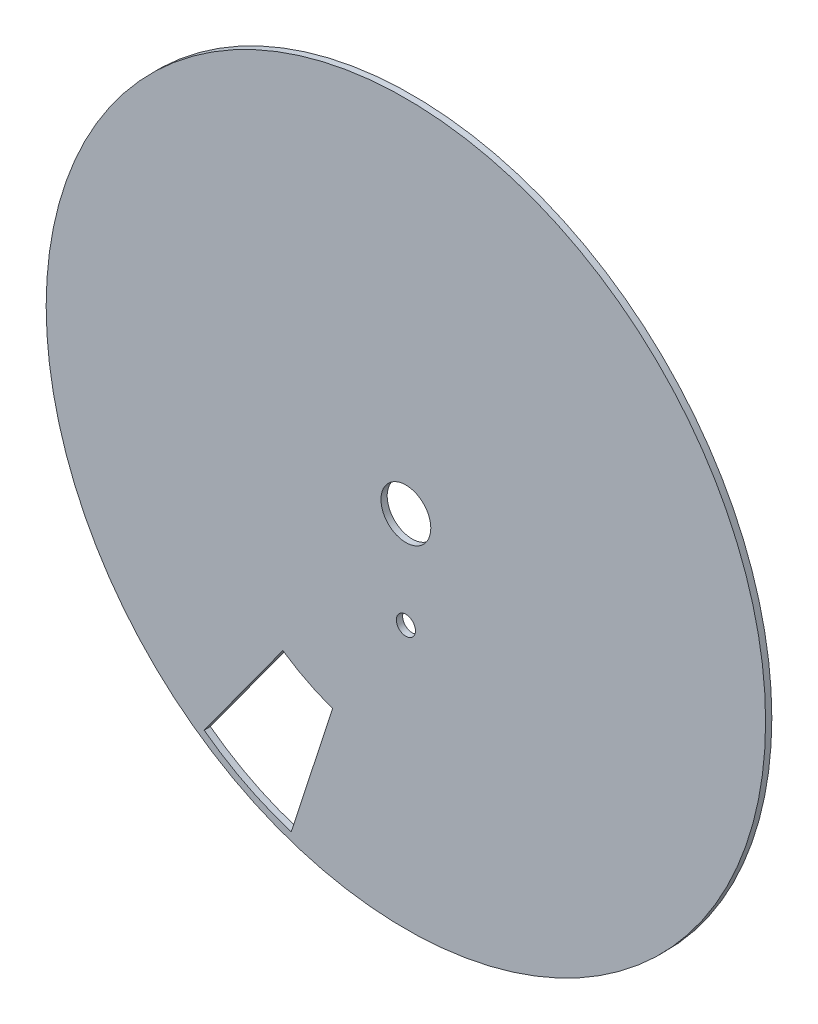
ISO-10303-21;
HEADER;
FILE_DESCRIPTION(('STEP AP214'),'2;1');
FILE_NAME('part.step','',(''),(''),'','','');
FILE_SCHEMA(('AUTOMOTIVE_DESIGN { 1 0 10303 214 1 1 1 1 }'));
ENDSEC;
DATA;
#1=APPLICATION_CONTEXT('core data for automotive mechanical design processes');
#2=APPLICATION_PROTOCOL_DEFINITION('international standard','automotive_design',2000,#1);
#3=PRODUCT_CONTEXT('',#1,'mechanical');
#4=PRODUCT('Part','Part','',(#3));
#5=PRODUCT_RELATED_PRODUCT_CATEGORY('part','',(#4));
#6=PRODUCT_DEFINITION_FORMATION('','',#4);
#7=PRODUCT_DEFINITION_CONTEXT('part definition',#1,'design');
#8=PRODUCT_DEFINITION('design','',#6,#7);
#9=PRODUCT_DEFINITION_SHAPE('','',#8);
#10=(LENGTH_UNIT() NAMED_UNIT(*) SI_UNIT(.MILLI.,.METRE.));
#11=(NAMED_UNIT(*) PLANE_ANGLE_UNIT() SI_UNIT($,.RADIAN.));
#12=(NAMED_UNIT(*) SI_UNIT($,.STERADIAN.) SOLID_ANGLE_UNIT());
#13=UNCERTAINTY_MEASURE_WITH_UNIT(LENGTH_MEASURE(1.E-05),#10,'distance_accuracy_value','');
#14=(GEOMETRIC_REPRESENTATION_CONTEXT(3) GLOBAL_UNCERTAINTY_ASSIGNED_CONTEXT((#13)) GLOBAL_UNIT_ASSIGNED_CONTEXT((#10,
#11,#12)) REPRESENTATION_CONTEXT('',''));
#15=CARTESIAN_POINT('',(0.,0.,0.));
#16=DIRECTION('',(0.,0.,1.));
#17=DIRECTION('',(1.,0.,0.));
#18=AXIS2_PLACEMENT_3D('',#15,#16,#17);
#19=CARTESIAN_POINT('',(0.,0.,1.));
#20=DIRECTION('',(0.,0.,1.));
#21=DIRECTION('',(1.,0.,0.));
#22=AXIS2_PLACEMENT_3D('',#19,#20,#21);
#23=PLANE('',#22);
#24=CARTESIAN_POINT('',(1.1518563880486E-12,2.30718222304915E-12,1.));
#25=DIRECTION('',(0.,0.,1.));
#26=DIRECTION('',(-1.,0.,0.));
#27=AXIS2_PLACEMENT_3D('',#24,#25,#26);
#28=CIRCLE('',#27,35.0000000000026);
#29=CARTESIAN_POINT('',(-19.7550681893245,-28.8918203101699,1.));
#30=VERTEX_POINT('',#29);
#31=CARTESIAN_POINT('',(-11.7622358896326,-32.9643717804032,1.));
#32=VERTEX_POINT('',#31);
#33=EDGE_CURVE('E78',#30,#32,#28,.T.);
#34=ORIENTED_EDGE('',*,*,#33,.T.);
#35=DIRECTION('',(-0.309016994374947,-0.951056516295154,0.));
#36=VECTOR('',#35,1.);
#37=CARTESIAN_POINT('',(-11.7622358896326,-32.9643717804032,1.));
#38=LINE('',#37,#36);
#39=CARTESIAN_POINT('',(-18.4051799941896,-53.4092514893739,1.));
#40=VERTEX_POINT('',#39);
#41=EDGE_CURVE('E87',#32,#40,#38,.T.);
#42=ORIENTED_EDGE('',*,*,#41,.T.);
#43=CARTESIAN_POINT('',(-4.7115915098692,-9.25861487224373,1.));
#44=DIRECTION('',(0.,0.,-1.));
#45=DIRECTION('',(-1.,0.,0.));
#46=AXIS2_PLACEMENT_3D('',#43,#44,#45);
#47=CIRCLE('',#46,46.2254592110862);
#48=CARTESIAN_POINT('',(-32.3896479515654,-46.2818274676692,1.));
#49=VERTEX_POINT('',#48);
#50=EDGE_CURVE('E50',#40,#49,#47,.T.);
#51=ORIENTED_EDGE('',*,*,#50,.T.);
#52=DIRECTION('',(0.587785252292473,0.809016994374948,0.));
#53=VECTOR('',#52,1.);
#54=CARTESIAN_POINT('',(-19.7550681893245,-28.8918203101699,1.));
#55=LINE('',#54,#53);
#56=EDGE_CURVE('E84',#49,#30,#55,.T.);
#57=ORIENTED_EDGE('',*,*,#56,.T.);
#58=EDGE_LOOP('',(#34,#42,#51,#57));
#59=FACE_BOUND('',#58,.T.);
#60=CARTESIAN_POINT('',(-7.00080184795615E-12,-15.5040048462578,1.));
#61=DIRECTION('',(0.,0.,-1.));
#62=DIRECTION('',(-1.,0.,0.));
#63=AXIS2_PLACEMENT_3D('',#60,#61,#62);
#64=CIRCLE('',#63,1.53);
#65=CARTESIAN_POINT('',(-1.530000000007,-15.5040048462578,1.));
#66=VERTEX_POINT('',#65);
#67=EDGE_CURVE('E108',#66,#66,#64,.T.);
#68=ORIENTED_EDGE('',*,*,#67,.T.);
#69=EDGE_LOOP('',(#68));
#70=FACE_BOUND('',#69,.T.);
#71=CARTESIAN_POINT('',(0.,0.,1.));
#72=DIRECTION('',(0.,0.,1.));
#73=DIRECTION('',(1.,0.,0.));
#74=AXIS2_PLACEMENT_3D('',#71,#72,#73);
#75=CIRCLE('',#74,57.75);
#76=CARTESIAN_POINT('',(57.75,0.,1.));
#77=VERTEX_POINT('',#76);
#78=EDGE_CURVE('E11',#77,#77,#75,.T.);
#79=ORIENTED_EDGE('',*,*,#78,.T.);
#80=EDGE_LOOP('',(#79));
#81=FACE_BOUND('',#80,.T.);
#82=CARTESIAN_POINT('',(0.,0.,1.));
#83=DIRECTION('',(0.,0.,1.));
#84=DIRECTION('',(1.,0.,0.));
#85=AXIS2_PLACEMENT_3D('',#82,#83,#84);
#86=CIRCLE('',#85,4.);
#87=CARTESIAN_POINT('',(4.,0.,1.));
#88=VERTEX_POINT('',#87);
#89=EDGE_CURVE('E114',#88,#88,#86,.T.);
#90=ORIENTED_EDGE('',*,*,#89,.F.);
#91=EDGE_LOOP('',(#90));
#92=FACE_BOUND('',#91,.T.);
#93=ADVANCED_FACE('F33',(#59,#70,#81,#92),#23,.T.);
#94=CARTESIAN_POINT('',(0.,0.,0.));
#95=DIRECTION('',(0.,0.,1.));
#96=DIRECTION('',(1.,0.,0.));
#97=AXIS2_PLACEMENT_3D('',#94,#95,#96);
#98=PLANE('',#97);
#99=DIRECTION('',(-0.309016994374947,-0.951056516295154,0.));
#100=VECTOR('',#99,1.);
#101=CARTESIAN_POINT('',(-11.7622358896326,-32.9643717804032,0.));
#102=LINE('',#101,#100);
#103=CARTESIAN_POINT('',(-11.7622358896326,-32.9643717804032,0.));
#104=VERTEX_POINT('',#103);
#105=CARTESIAN_POINT('',(-18.4051799941896,-53.4092514893739,0.));
#106=VERTEX_POINT('',#105);
#107=EDGE_CURVE('E102',#104,#106,#102,.T.);
#108=ORIENTED_EDGE('',*,*,#107,.F.);
#109=CARTESIAN_POINT('',(1.1518563880486E-12,2.30718222304915E-12,0.));
#110=DIRECTION('',(0.,0.,1.));
#111=DIRECTION('',(-1.,0.,0.));
#112=AXIS2_PLACEMENT_3D('',#109,#110,#111);
#113=CIRCLE('',#112,35.0000000000026);
#114=CARTESIAN_POINT('',(-19.7550681893245,-28.8918203101699,0.));
#115=VERTEX_POINT('',#114);
#116=EDGE_CURVE('E58',#115,#104,#113,.T.);
#117=ORIENTED_EDGE('',*,*,#116,.F.);
#118=DIRECTION('',(0.587785252292473,0.809016994374948,0.));
#119=VECTOR('',#118,1.);
#120=CARTESIAN_POINT('',(-19.7550681893245,-28.8918203101699,0.));
#121=LINE('',#120,#119);
#122=CARTESIAN_POINT('',(-32.3896479515654,-46.2818274676692,0.));
#123=VERTEX_POINT('',#122);
#124=EDGE_CURVE('E93',#123,#115,#121,.T.);
#125=ORIENTED_EDGE('',*,*,#124,.F.);
#126=CARTESIAN_POINT('',(-4.7115915098692,-9.25861487224373,0.));
#127=DIRECTION('',(0.,0.,-1.));
#128=DIRECTION('',(-1.,0.,0.));
#129=AXIS2_PLACEMENT_3D('',#126,#127,#128);
#130=CIRCLE('',#129,46.2254592110862);
#131=EDGE_CURVE('E96',#106,#123,#130,.T.);
#132=ORIENTED_EDGE('',*,*,#131,.F.);
#133=EDGE_LOOP('',(#108,#117,#125,#132));
#134=FACE_BOUND('',#133,.T.);
#135=CARTESIAN_POINT('',(-7.00080184795615E-12,-15.5040048462578,0.));
#136=DIRECTION('',(0.,0.,1.));
#137=DIRECTION('',(1.,0.,0.));
#138=AXIS2_PLACEMENT_3D('',#135,#136,#137);
#139=CIRCLE('',#138,1.53);
#140=CARTESIAN_POINT('',(1.529999999993,-15.5040048462578,0.));
#141=VERTEX_POINT('',#140);
#142=EDGE_CURVE('E37',#141,#141,#139,.T.);
#143=ORIENTED_EDGE('',*,*,#142,.T.);
#144=EDGE_LOOP('',(#143));
#145=FACE_BOUND('',#144,.T.);
#146=CARTESIAN_POINT('',(0.,0.,0.));
#147=DIRECTION('',(0.,0.,1.));
#148=DIRECTION('',(1.,0.,0.));
#149=AXIS2_PLACEMENT_3D('',#146,#147,#148);
#150=CIRCLE('',#149,57.75);
#151=CARTESIAN_POINT('',(57.75,0.,0.));
#152=VERTEX_POINT('',#151);
#153=EDGE_CURVE('E42',#152,#152,#150,.T.);
#154=ORIENTED_EDGE('',*,*,#153,.F.);
#155=EDGE_LOOP('',(#154));
#156=FACE_BOUND('',#155,.T.);
#157=CARTESIAN_POINT('',(0.,0.,0.));
#158=DIRECTION('',(0.,0.,1.));
#159=DIRECTION('',(1.,0.,0.));
#160=AXIS2_PLACEMENT_3D('',#157,#158,#159);
#161=CIRCLE('',#160,4.);
#162=CARTESIAN_POINT('',(4.,0.,0.));
#163=VERTEX_POINT('',#162);
#164=EDGE_CURVE('E117',#163,#163,#161,.T.);
#165=ORIENTED_EDGE('',*,*,#164,.T.);
#166=EDGE_LOOP('',(#165));
#167=FACE_BOUND('',#166,.T.);
#168=ADVANCED_FACE('F123',(#134,#145,#156,#167),#98,.F.);
#169=CARTESIAN_POINT('',(0.,0.,1.));
#170=DIRECTION('',(0.,0.,-1.));
#171=DIRECTION('',(-1.,0.,0.));
#172=AXIS2_PLACEMENT_3D('',#169,#170,#171);
#173=CYLINDRICAL_SURFACE('',#172,57.75);
#174=ORIENTED_EDGE('',*,*,#78,.F.);
#175=EDGE_LOOP('',(#174));
#176=FACE_BOUND('',#175,.T.);
#177=ORIENTED_EDGE('',*,*,#153,.T.);
#178=EDGE_LOOP('',(#177));
#179=FACE_BOUND('',#178,.T.);
#180=ADVANCED_FACE('F35',(#176,#179),#173,.T.);
#181=CARTESIAN_POINT('',(0.,0.,1.));
#182=DIRECTION('',(0.,0.,-1.));
#183=DIRECTION('',(-1.,0.,0.));
#184=AXIS2_PLACEMENT_3D('',#181,#182,#183);
#185=CYLINDRICAL_SURFACE('',#184,4.);
#186=ORIENTED_EDGE('',*,*,#89,.T.);
#187=EDGE_LOOP('',(#186));
#188=FACE_BOUND('',#187,.T.);
#189=ORIENTED_EDGE('',*,*,#164,.F.);
#190=EDGE_LOOP('',(#189));
#191=FACE_BOUND('',#190,.T.);
#192=ADVANCED_FACE('F129',(#188,#191),#185,.F.);
#193=CARTESIAN_POINT('',(-7.00080184795615E-12,-15.5040048462578,1.));
#194=DIRECTION('',(0.,0.,-1.));
#195=DIRECTION('',(-1.,0.,0.));
#196=AXIS2_PLACEMENT_3D('',#193,#194,#195);
#197=CYLINDRICAL_SURFACE('',#196,1.53);
#198=ORIENTED_EDGE('',*,*,#67,.F.);
#199=EDGE_LOOP('',(#198));
#200=FACE_BOUND('',#199,.T.);
#201=ORIENTED_EDGE('',*,*,#142,.F.);
#202=EDGE_LOOP('',(#201));
#203=FACE_BOUND('',#202,.T.);
#204=ADVANCED_FACE('F131',(#200,#203),#197,.F.);
#205=CARTESIAN_POINT('',(1.1518563880486E-12,2.30718222304915E-12,1.));
#206=DIRECTION('',(0.,0.,-1.));
#207=DIRECTION('',(-1.,0.,0.));
#208=AXIS2_PLACEMENT_3D('',#205,#206,#207);
#209=CYLINDRICAL_SURFACE('',#208,35.0000000000026);
#210=ORIENTED_EDGE('',*,*,#116,.T.);
#211=DIRECTION('',(0.,0.,-1.));
#212=VECTOR('',#211,1.);
#213=CARTESIAN_POINT('',(-11.7622358896326,-32.9643717804032,1.));
#214=LINE('',#213,#212);
#215=EDGE_CURVE('E74',#32,#104,#214,.T.);
#216=ORIENTED_EDGE('',*,*,#215,.F.);
#217=ORIENTED_EDGE('',*,*,#33,.F.);
#218=DIRECTION('',(0.,0.,-1.));
#219=VECTOR('',#218,1.);
#220=CARTESIAN_POINT('',(-19.7550681893245,-28.8918203101699,1.));
#221=LINE('',#220,#219);
#222=EDGE_CURVE('E106',#30,#115,#221,.T.);
#223=ORIENTED_EDGE('',*,*,#222,.T.);
#224=EDGE_LOOP('',(#210,#216,#217,#223));
#225=FACE_BOUND('',#224,.T.);
#226=ADVANCED_FACE('F76',(#225),#209,.T.);
#227=CARTESIAN_POINT('',(-19.7550681893245,-28.8918203101699,1.));
#228=DIRECTION('',(-0.809016994374948,0.587785252292473,0.));
#229=DIRECTION('',(-0.587785252292473,-0.809016994374948,0.));
#230=AXIS2_PLACEMENT_3D('',#227,#228,#229);
#231=PLANE('',#230);
#232=ORIENTED_EDGE('',*,*,#124,.T.);
#233=ORIENTED_EDGE('',*,*,#222,.F.);
#234=ORIENTED_EDGE('',*,*,#56,.F.);
#235=DIRECTION('',(0.,0.,-1.));
#236=VECTOR('',#235,1.);
#237=CARTESIAN_POINT('',(-32.3896479515654,-46.2818274676692,1.));
#238=LINE('',#237,#236);
#239=EDGE_CURVE('E109',#49,#123,#238,.T.);
#240=ORIENTED_EDGE('',*,*,#239,.T.);
#241=EDGE_LOOP('',(#232,#233,#234,#240));
#242=FACE_BOUND('',#241,.T.);
#243=ADVANCED_FACE('F172',(#242),#231,.F.);
#244=CARTESIAN_POINT('',(-4.7115915098692,-9.25861487224373,1.));
#245=DIRECTION('',(0.,0.,-1.));
#246=DIRECTION('',(-1.,0.,0.));
#247=AXIS2_PLACEMENT_3D('',#244,#245,#246);
#248=CYLINDRICAL_SURFACE('',#247,46.2254592110862);
#249=ORIENTED_EDGE('',*,*,#131,.T.);
#250=ORIENTED_EDGE('',*,*,#239,.F.);
#251=ORIENTED_EDGE('',*,*,#50,.F.);
#252=DIRECTION('',(0.,0.,-1.));
#253=VECTOR('',#252,1.);
#254=CARTESIAN_POINT('',(-18.4051799941896,-53.4092514893739,1.));
#255=LINE('',#254,#253);
#256=EDGE_CURVE('E83',#40,#106,#255,.T.);
#257=ORIENTED_EDGE('',*,*,#256,.T.);
#258=EDGE_LOOP('',(#249,#250,#251,#257));
#259=FACE_BOUND('',#258,.T.);
#260=ADVANCED_FACE('F178',(#259),#248,.F.);
#261=CARTESIAN_POINT('',(-11.7622358896326,-32.9643717804032,1.));
#262=DIRECTION('',(0.951056516295154,-0.309016994374947,0.));
#263=DIRECTION('',(0.309016994374947,0.951056516295154,0.));
#264=AXIS2_PLACEMENT_3D('',#261,#262,#263);
#265=PLANE('',#264);
#266=ORIENTED_EDGE('',*,*,#107,.T.);
#267=ORIENTED_EDGE('',*,*,#256,.F.);
#268=ORIENTED_EDGE('',*,*,#41,.F.);
#269=ORIENTED_EDGE('',*,*,#215,.T.);
#270=EDGE_LOOP('',(#266,#267,#268,#269));
#271=FACE_BOUND('',#270,.T.);
#272=ADVANCED_FACE('F88',(#271),#265,.F.);
#273=CLOSED_SHELL('',(#93,#168,#180,#192,#204,#226,#243,#260,#272));
#274=MANIFOLD_SOLID_BREP('B2',#273);
#275=ADVANCED_BREP_SHAPE_REPRESENTATION('',(#18,#274),#14);
#276=SHAPE_DEFINITION_REPRESENTATION(#9,#275);
ENDSEC;
END-ISO-10303-21;
